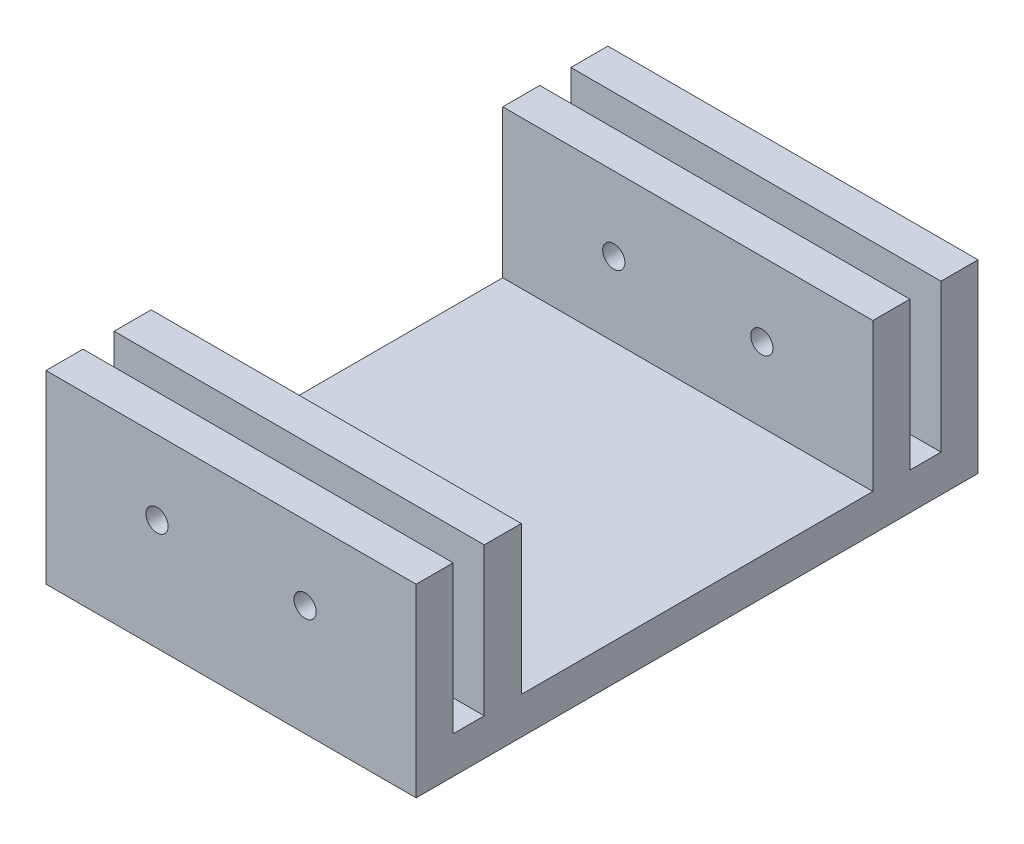
ISO-10303-21;
HEADER;
FILE_DESCRIPTION(('STEP AP214'),'2;1');
FILE_NAME('part.step','',(''),(''),'','','');
FILE_SCHEMA(('AUTOMOTIVE_DESIGN { 1 0 10303 214 1 1 1 1 }'));
ENDSEC;
DATA;
#1=APPLICATION_CONTEXT('core data for automotive mechanical design processes');
#2=APPLICATION_PROTOCOL_DEFINITION('international standard','automotive_design',2000,#1);
#3=PRODUCT_CONTEXT('',#1,'mechanical');
#4=PRODUCT('Part','Part','',(#3));
#5=PRODUCT_RELATED_PRODUCT_CATEGORY('part','',(#4));
#6=PRODUCT_DEFINITION_FORMATION('','',#4);
#7=PRODUCT_DEFINITION_CONTEXT('part definition',#1,'design');
#8=PRODUCT_DEFINITION('design','',#6,#7);
#9=PRODUCT_DEFINITION_SHAPE('','',#8);
#10=(LENGTH_UNIT() NAMED_UNIT(*) SI_UNIT(.MILLI.,.METRE.));
#11=(NAMED_UNIT(*) PLANE_ANGLE_UNIT() SI_UNIT($,.RADIAN.));
#12=(NAMED_UNIT(*) SI_UNIT($,.STERADIAN.) SOLID_ANGLE_UNIT());
#13=UNCERTAINTY_MEASURE_WITH_UNIT(LENGTH_MEASURE(1.E-05),#10,'distance_accuracy_value','');
#14=(GEOMETRIC_REPRESENTATION_CONTEXT(3) GLOBAL_UNCERTAINTY_ASSIGNED_CONTEXT((#13)) GLOBAL_UNIT_ASSIGNED_CONTEXT((#10,
#11,#12)) REPRESENTATION_CONTEXT('',''));
#15=CARTESIAN_POINT('',(0.,0.,0.));
#16=DIRECTION('',(0.,0.,1.));
#17=DIRECTION('',(1.,0.,0.));
#18=AXIS2_PLACEMENT_3D('',#15,#16,#17);
#19=CARTESIAN_POINT('',(50.,22.5,-41.4818181818182));
#20=DIRECTION('',(0.,-1.,0.));
#21=DIRECTION('',(0.,0.,-1.));
#22=AXIS2_PLACEMENT_3D('',#19,#20,#21);
#23=PLANE('',#22);
#24=DIRECTION('',(0.,0.,1.));
#25=VECTOR('',#24,1.);
#26=CARTESIAN_POINT('',(0.,22.5,-41.4818181818182));
#27=LINE('',#26,#25);
#28=CARTESIAN_POINT('',(0.,22.5,-41.4818181818182));
#29=VERTEX_POINT('',#28);
#30=CARTESIAN_POINT('',(0.,22.5,-36.4818181818182));
#31=VERTEX_POINT('',#30);
#32=EDGE_CURVE('E185',#29,#31,#27,.T.);
#33=ORIENTED_EDGE('',*,*,#32,.T.);
#34=DIRECTION('',(-1.,0.,0.));
#35=VECTOR('',#34,1.);
#36=CARTESIAN_POINT('',(50.,22.5,-36.4818181818182));
#37=LINE('',#36,#35);
#38=CARTESIAN_POINT('',(50.,22.5,-36.4818181818182));
#39=VERTEX_POINT('',#38);
#40=EDGE_CURVE('E44',#39,#31,#37,.T.);
#41=ORIENTED_EDGE('',*,*,#40,.F.);
#42=DIRECTION('',(0.,0.,1.));
#43=VECTOR('',#42,1.);
#44=CARTESIAN_POINT('',(50.,22.5,-41.4818181818182));
#45=LINE('',#44,#43);
#46=CARTESIAN_POINT('',(50.,22.5,-41.4818181818182));
#47=VERTEX_POINT('',#46);
#48=EDGE_CURVE('E120',#47,#39,#45,.T.);
#49=ORIENTED_EDGE('',*,*,#48,.F.);
#50=DIRECTION('',(-1.,0.,0.));
#51=VECTOR('',#50,1.);
#52=CARTESIAN_POINT('',(50.,22.5,-41.4818181818182));
#53=LINE('',#52,#51);
#54=EDGE_CURVE('E11',#47,#29,#53,.T.);
#55=ORIENTED_EDGE('',*,*,#54,.T.);
#56=EDGE_LOOP('',(#33,#41,#49,#55));
#57=FACE_BOUND('',#56,.T.);
#58=ADVANCED_FACE('F35',(#57),#23,.F.);
#59=CARTESIAN_POINT('',(50.,22.5,-36.4818181818182));
#60=DIRECTION('',(0.,0.,-1.));
#61=DIRECTION('',(-1.,0.,0.));
#62=AXIS2_PLACEMENT_3D('',#59,#60,#61);
#63=PLANE('',#62);
#64=CARTESIAN_POINT('',(35.,12.5,-36.4818181818182));
#65=DIRECTION('',(0.,0.,-1.));
#66=DIRECTION('',(-1.,0.,0.));
#67=AXIS2_PLACEMENT_3D('',#64,#65,#66);
#68=CIRCLE('',#67,1.5);
#69=CARTESIAN_POINT('',(33.4999999999999,12.5,-36.4818181818182));
#70=VERTEX_POINT('',#69);
#71=EDGE_CURVE('E259',#70,#70,#68,.T.);
#72=ORIENTED_EDGE('',*,*,#71,.T.);
#73=EDGE_LOOP('',(#72));
#74=FACE_BOUND('',#73,.T.);
#75=CARTESIAN_POINT('',(14.9999999999999,12.5,-36.4818181818182));
#76=DIRECTION('',(0.,0.,-1.));
#77=DIRECTION('',(-1.,0.,0.));
#78=AXIS2_PLACEMENT_3D('',#75,#76,#77);
#79=CIRCLE('',#78,1.5);
#80=CARTESIAN_POINT('',(13.4999999999999,12.5,-36.4818181818182));
#81=VERTEX_POINT('',#80);
#82=EDGE_CURVE('E188',#81,#81,#79,.T.);
#83=ORIENTED_EDGE('',*,*,#82,.T.);
#84=EDGE_LOOP('',(#83));
#85=FACE_BOUND('',#84,.T.);
#86=DIRECTION('',(0.,-1.,0.));
#87=VECTOR('',#86,1.);
#88=CARTESIAN_POINT('',(0.,22.5,-36.4818181818182));
#89=LINE('',#88,#87);
#90=CARTESIAN_POINT('',(0.,2.5,-36.4818181818182));
#91=VERTEX_POINT('',#90);
#92=EDGE_CURVE('E187',#31,#91,#89,.T.);
#93=ORIENTED_EDGE('',*,*,#92,.T.);
#94=DIRECTION('',(-1.,0.,0.));
#95=VECTOR('',#94,1.);
#96=CARTESIAN_POINT('',(50.,2.5,-36.4818181818182));
#97=LINE('',#96,#95);
#98=CARTESIAN_POINT('',(50.,2.5,-36.4818181818182));
#99=VERTEX_POINT('',#98);
#100=EDGE_CURVE('E245',#99,#91,#97,.T.);
#101=ORIENTED_EDGE('',*,*,#100,.F.);
#102=DIRECTION('',(0.,-1.,0.));
#103=VECTOR('',#102,1.);
#104=CARTESIAN_POINT('',(50.,22.5,-36.4818181818182));
#105=LINE('',#104,#103);
#106=EDGE_CURVE('E283',#39,#99,#105,.T.);
#107=ORIENTED_EDGE('',*,*,#106,.F.);
#108=ORIENTED_EDGE('',*,*,#40,.T.);
#109=EDGE_LOOP('',(#93,#101,#107,#108));
#110=FACE_BOUND('',#109,.T.);
#111=ADVANCED_FACE('F322',(#74,#85,#110),#63,.F.);
#112=CARTESIAN_POINT('',(50.,2.5,-32.2818181818182));
#113=DIRECTION('',(0.,-1.,0.));
#114=DIRECTION('',(0.,0.,-1.));
#115=AXIS2_PLACEMENT_3D('',#112,#113,#114);
#116=PLANE('',#115);
#117=DIRECTION('',(0.,0.,1.));
#118=VECTOR('',#117,1.);
#119=CARTESIAN_POINT('',(0.,2.5,-32.2818181818182));
#120=LINE('',#119,#118);
#121=CARTESIAN_POINT('',(0.,2.5,-32.2818181818182));
#122=VERTEX_POINT('',#121);
#123=EDGE_CURVE('E190',#91,#122,#120,.T.);
#124=ORIENTED_EDGE('',*,*,#123,.T.);
#125=DIRECTION('',(-1.,0.,0.));
#126=VECTOR('',#125,1.);
#127=CARTESIAN_POINT('',(50.,2.5,-32.2818181818182));
#128=LINE('',#127,#126);
#129=CARTESIAN_POINT('',(50.,2.5,-32.2818181818182));
#130=VERTEX_POINT('',#129);
#131=EDGE_CURVE('E242',#130,#122,#128,.T.);
#132=ORIENTED_EDGE('',*,*,#131,.F.);
#133=DIRECTION('',(0.,0.,1.));
#134=VECTOR('',#133,1.);
#135=CARTESIAN_POINT('',(50.,2.5,-32.2818181818182));
#136=LINE('',#135,#134);
#137=EDGE_CURVE('E285',#99,#130,#136,.T.);
#138=ORIENTED_EDGE('',*,*,#137,.F.);
#139=ORIENTED_EDGE('',*,*,#100,.T.);
#140=EDGE_LOOP('',(#124,#132,#138,#139));
#141=FACE_BOUND('',#140,.T.);
#142=ADVANCED_FACE('F327',(#141),#116,.F.);
#143=CARTESIAN_POINT('',(50.,2.5,-32.2818181818182));
#144=DIRECTION('',(0.,0.,1.));
#145=DIRECTION('',(1.,0.,0.));
#146=AXIS2_PLACEMENT_3D('',#143,#144,#145);
#147=PLANE('',#146);
#148=CARTESIAN_POINT('',(35.,12.5,-32.2818181818182));
#149=DIRECTION('',(0.,0.,1.));
#150=DIRECTION('',(1.,0.,0.));
#151=AXIS2_PLACEMENT_3D('',#148,#149,#150);
#152=CIRCLE('',#151,1.5);
#153=CARTESIAN_POINT('',(36.5,12.5,-32.2818181818182));
#154=VERTEX_POINT('',#153);
#155=EDGE_CURVE('E264',#154,#154,#152,.T.);
#156=ORIENTED_EDGE('',*,*,#155,.T.);
#157=EDGE_LOOP('',(#156));
#158=FACE_BOUND('',#157,.T.);
#159=CARTESIAN_POINT('',(14.9999999999999,12.5,-32.2818181818182));
#160=DIRECTION('',(0.,0.,1.));
#161=DIRECTION('',(1.,0.,0.));
#162=AXIS2_PLACEMENT_3D('',#159,#160,#161);
#163=CIRCLE('',#162,1.5);
#164=CARTESIAN_POINT('',(16.4999999999999,12.5,-32.2818181818182));
#165=VERTEX_POINT('',#164);
#166=EDGE_CURVE('E276',#165,#165,#163,.T.);
#167=ORIENTED_EDGE('',*,*,#166,.T.);
#168=EDGE_LOOP('',(#167));
#169=FACE_BOUND('',#168,.T.);
#170=DIRECTION('',(0.,1.,0.));
#171=VECTOR('',#170,1.);
#172=CARTESIAN_POINT('',(0.,2.5,-32.2818181818182));
#173=LINE('',#172,#171);
#174=CARTESIAN_POINT('',(0.,22.5,-32.2818181818182));
#175=VERTEX_POINT('',#174);
#176=EDGE_CURVE('E192',#122,#175,#173,.T.);
#177=ORIENTED_EDGE('',*,*,#176,.T.);
#178=DIRECTION('',(-1.,0.,0.));
#179=VECTOR('',#178,1.);
#180=CARTESIAN_POINT('',(50.,22.5,-32.2818181818182));
#181=LINE('',#180,#179);
#182=CARTESIAN_POINT('',(50.,22.5,-32.2818181818182));
#183=VERTEX_POINT('',#182);
#184=EDGE_CURVE('E239',#183,#175,#181,.T.);
#185=ORIENTED_EDGE('',*,*,#184,.F.);
#186=DIRECTION('',(0.,1.,0.));
#187=VECTOR('',#186,1.);
#188=CARTESIAN_POINT('',(50.,2.5,-32.2818181818182));
#189=LINE('',#188,#187);
#190=EDGE_CURVE('E287',#130,#183,#189,.T.);
#191=ORIENTED_EDGE('',*,*,#190,.F.);
#192=ORIENTED_EDGE('',*,*,#131,.T.);
#193=EDGE_LOOP('',(#177,#185,#191,#192));
#194=FACE_BOUND('',#193,.T.);
#195=ADVANCED_FACE('F333',(#158,#169,#194),#147,.F.);
#196=CARTESIAN_POINT('',(50.,22.5,-32.2818181818182));
#197=DIRECTION('',(0.,-1.,0.));
#198=DIRECTION('',(0.,0.,-1.));
#199=AXIS2_PLACEMENT_3D('',#196,#197,#198);
#200=PLANE('',#199);
#201=DIRECTION('',(0.,0.,1.));
#202=VECTOR('',#201,1.);
#203=CARTESIAN_POINT('',(0.,22.5,-32.2818181818182));
#204=LINE('',#203,#202);
#205=CARTESIAN_POINT('',(0.,22.5,-27.2818181818182));
#206=VERTEX_POINT('',#205);
#207=EDGE_CURVE('E194',#175,#206,#204,.T.);
#208=ORIENTED_EDGE('',*,*,#207,.T.);
#209=DIRECTION('',(-1.,0.,0.));
#210=VECTOR('',#209,1.);
#211=CARTESIAN_POINT('',(50.,22.5,-27.2818181818182));
#212=LINE('',#211,#210);
#213=CARTESIAN_POINT('',(50.,22.5,-27.2818181818182));
#214=VERTEX_POINT('',#213);
#215=EDGE_CURVE('E236',#214,#206,#212,.T.);
#216=ORIENTED_EDGE('',*,*,#215,.F.);
#217=DIRECTION('',(0.,0.,1.));
#218=VECTOR('',#217,1.);
#219=CARTESIAN_POINT('',(50.,22.5,-32.2818181818182));
#220=LINE('',#219,#218);
#221=EDGE_CURVE('E289',#183,#214,#220,.T.);
#222=ORIENTED_EDGE('',*,*,#221,.F.);
#223=ORIENTED_EDGE('',*,*,#184,.T.);
#224=EDGE_LOOP('',(#208,#216,#222,#223));
#225=FACE_BOUND('',#224,.T.);
#226=ADVANCED_FACE('F337',(#225),#200,.F.);
#227=CARTESIAN_POINT('',(50.,22.5,-27.2818181818182));
#228=DIRECTION('',(0.,0.,-1.));
#229=DIRECTION('',(0.,1.,0.));
#230=AXIS2_PLACEMENT_3D('',#227,#228,#229);
#231=PLANE('',#230);
#232=CARTESIAN_POINT('',(35.,12.5,-27.2818181818182));
#233=DIRECTION('',(0.,0.,-1.));
#234=DIRECTION('',(0.,1.,0.));
#235=AXIS2_PLACEMENT_3D('',#232,#233,#234);
#236=CIRCLE('',#235,1.5);
#237=CARTESIAN_POINT('',(35.,14.,-27.2818181818182));
#238=VERTEX_POINT('',#237);
#239=EDGE_CURVE('E455',#238,#238,#236,.T.);
#240=ORIENTED_EDGE('',*,*,#239,.T.);
#241=EDGE_LOOP('',(#240));
#242=FACE_BOUND('',#241,.T.);
#243=CARTESIAN_POINT('',(14.9999999999999,12.5,-27.2818181818182));
#244=DIRECTION('',(0.,0.,-1.));
#245=DIRECTION('',(0.,1.,0.));
#246=AXIS2_PLACEMENT_3D('',#243,#244,#245);
#247=CIRCLE('',#246,1.5);
#248=CARTESIAN_POINT('',(14.9999999999999,14.,-27.2818181818182));
#249=VERTEX_POINT('',#248);
#250=EDGE_CURVE('E273',#249,#249,#247,.T.);
#251=ORIENTED_EDGE('',*,*,#250,.T.);
#252=EDGE_LOOP('',(#251));
#253=FACE_BOUND('',#252,.T.);
#254=DIRECTION('',(0.,-1.,0.));
#255=VECTOR('',#254,1.);
#256=CARTESIAN_POINT('',(0.,22.5,-27.2818181818182));
#257=LINE('',#256,#255);
#258=CARTESIAN_POINT('',(0.,2.5,-27.2818181818182));
#259=VERTEX_POINT('',#258);
#260=EDGE_CURVE('E196',#206,#259,#257,.T.);
#261=ORIENTED_EDGE('',*,*,#260,.T.);
#262=DIRECTION('',(-1.,0.,0.));
#263=VECTOR('',#262,1.);
#264=CARTESIAN_POINT('',(50.,2.5,-27.2818181818182));
#265=LINE('',#264,#263);
#266=CARTESIAN_POINT('',(50.,2.5,-27.2818181818182));
#267=VERTEX_POINT('',#266);
#268=EDGE_CURVE('E233',#267,#259,#265,.T.);
#269=ORIENTED_EDGE('',*,*,#268,.F.);
#270=DIRECTION('',(0.,-1.,0.));
#271=VECTOR('',#270,1.);
#272=CARTESIAN_POINT('',(50.,22.5,-27.2818181818182));
#273=LINE('',#272,#271);
#274=EDGE_CURVE('E291',#214,#267,#273,.T.);
#275=ORIENTED_EDGE('',*,*,#274,.F.);
#276=ORIENTED_EDGE('',*,*,#215,.T.);
#277=EDGE_LOOP('',(#261,#269,#275,#276));
#278=FACE_BOUND('',#277,.T.);
#279=ADVANCED_FACE('F342',(#242,#253,#278),#231,.F.);
#280=CARTESIAN_POINT('',(50.,2.5,20.2181818181818));
#281=DIRECTION('',(0.,-1.,0.));
#282=DIRECTION('',(0.,0.,-1.));
#283=AXIS2_PLACEMENT_3D('',#280,#281,#282);
#284=PLANE('',#283);
#285=DIRECTION('',(0.,0.,1.));
#286=VECTOR('',#285,1.);
#287=CARTESIAN_POINT('',(0.,2.5,20.2181818181818));
#288=LINE('',#287,#286);
#289=CARTESIAN_POINT('',(0.,2.5,20.2181818181818));
#290=VERTEX_POINT('',#289);
#291=EDGE_CURVE('E198',#259,#290,#288,.T.);
#292=ORIENTED_EDGE('',*,*,#291,.T.);
#293=DIRECTION('',(-1.,0.,0.));
#294=VECTOR('',#293,1.);
#295=CARTESIAN_POINT('',(50.,2.5,20.2181818181818));
#296=LINE('',#295,#294);
#297=CARTESIAN_POINT('',(50.,2.5,20.2181818181818));
#298=VERTEX_POINT('',#297);
#299=EDGE_CURVE('E230',#298,#290,#296,.T.);
#300=ORIENTED_EDGE('',*,*,#299,.F.);
#301=DIRECTION('',(0.,0.,1.));
#302=VECTOR('',#301,1.);
#303=CARTESIAN_POINT('',(50.,2.5,20.2181818181818));
#304=LINE('',#303,#302);
#305=EDGE_CURVE('E293',#267,#298,#304,.T.);
#306=ORIENTED_EDGE('',*,*,#305,.F.);
#307=ORIENTED_EDGE('',*,*,#268,.T.);
#308=EDGE_LOOP('',(#292,#300,#306,#307));
#309=FACE_BOUND('',#308,.T.);
#310=ADVANCED_FACE('F348',(#309),#284,.F.);
#311=CARTESIAN_POINT('',(50.,22.5,20.2181818181818));
#312=DIRECTION('',(0.,0.,1.));
#313=DIRECTION('',(1.,0.,0.));
#314=AXIS2_PLACEMENT_3D('',#311,#312,#313);
#315=PLANE('',#314);
#316=CARTESIAN_POINT('',(35.,12.5,20.2181818181818));
#317=DIRECTION('',(0.,0.,1.));
#318=DIRECTION('',(1.,0.,0.));
#319=AXIS2_PLACEMENT_3D('',#316,#317,#318);
#320=CIRCLE('',#319,1.5);
#321=CARTESIAN_POINT('',(36.5,12.5,20.2181818181818));
#322=VERTEX_POINT('',#321);
#323=EDGE_CURVE('E402',#322,#322,#320,.T.);
#324=ORIENTED_EDGE('',*,*,#323,.T.);
#325=EDGE_LOOP('',(#324));
#326=FACE_BOUND('',#325,.T.);
#327=CARTESIAN_POINT('',(14.9999999999999,12.5,20.2181818181818));
#328=DIRECTION('',(0.,0.,1.));
#329=DIRECTION('',(1.,0.,0.));
#330=AXIS2_PLACEMENT_3D('',#327,#328,#329);
#331=CIRCLE('',#330,1.5);
#332=CARTESIAN_POINT('',(16.4999999999999,12.5,20.2181818181818));
#333=VERTEX_POINT('',#332);
#334=EDGE_CURVE('E270',#333,#333,#331,.T.);
#335=ORIENTED_EDGE('',*,*,#334,.T.);
#336=EDGE_LOOP('',(#335));
#337=FACE_BOUND('',#336,.T.);
#338=DIRECTION('',(0.,1.,0.));
#339=VECTOR('',#338,1.);
#340=CARTESIAN_POINT('',(0.,22.5,20.2181818181818));
#341=LINE('',#340,#339);
#342=CARTESIAN_POINT('',(0.,22.5,20.2181818181818));
#343=VERTEX_POINT('',#342);
#344=EDGE_CURVE('E200',#290,#343,#341,.T.);
#345=ORIENTED_EDGE('',*,*,#344,.T.);
#346=DIRECTION('',(-1.,0.,0.));
#347=VECTOR('',#346,1.);
#348=CARTESIAN_POINT('',(50.,22.5,20.2181818181818));
#349=LINE('',#348,#347);
#350=CARTESIAN_POINT('',(50.,22.5,20.2181818181818));
#351=VERTEX_POINT('',#350);
#352=EDGE_CURVE('E227',#351,#343,#349,.T.);
#353=ORIENTED_EDGE('',*,*,#352,.F.);
#354=DIRECTION('',(0.,1.,0.));
#355=VECTOR('',#354,1.);
#356=CARTESIAN_POINT('',(50.,22.5,20.2181818181818));
#357=LINE('',#356,#355);
#358=EDGE_CURVE('E295',#298,#351,#357,.T.);
#359=ORIENTED_EDGE('',*,*,#358,.F.);
#360=ORIENTED_EDGE('',*,*,#299,.T.);
#361=EDGE_LOOP('',(#345,#353,#359,#360));
#362=FACE_BOUND('',#361,.T.);
#363=ADVANCED_FACE('F352',(#326,#337,#362),#315,.F.);
#364=CARTESIAN_POINT('',(50.,22.5,25.2181818181818));
#365=DIRECTION('',(0.,-1.,0.));
#366=DIRECTION('',(0.,0.,-1.));
#367=AXIS2_PLACEMENT_3D('',#364,#365,#366);
#368=PLANE('',#367);
#369=DIRECTION('',(0.,0.,1.));
#370=VECTOR('',#369,1.);
#371=CARTESIAN_POINT('',(0.,22.5,25.2181818181818));
#372=LINE('',#371,#370);
#373=CARTESIAN_POINT('',(0.,22.5,25.2181818181818));
#374=VERTEX_POINT('',#373);
#375=EDGE_CURVE('E202',#343,#374,#372,.T.);
#376=ORIENTED_EDGE('',*,*,#375,.T.);
#377=DIRECTION('',(-1.,0.,0.));
#378=VECTOR('',#377,1.);
#379=CARTESIAN_POINT('',(50.,22.5,25.2181818181818));
#380=LINE('',#379,#378);
#381=CARTESIAN_POINT('',(50.,22.5,25.2181818181818));
#382=VERTEX_POINT('',#381);
#383=EDGE_CURVE('E224',#382,#374,#380,.T.);
#384=ORIENTED_EDGE('',*,*,#383,.F.);
#385=DIRECTION('',(0.,0.,1.));
#386=VECTOR('',#385,1.);
#387=CARTESIAN_POINT('',(50.,22.5,25.2181818181818));
#388=LINE('',#387,#386);
#389=EDGE_CURVE('E297',#351,#382,#388,.T.);
#390=ORIENTED_EDGE('',*,*,#389,.F.);
#391=ORIENTED_EDGE('',*,*,#352,.T.);
#392=EDGE_LOOP('',(#376,#384,#390,#391));
#393=FACE_BOUND('',#392,.T.);
#394=ADVANCED_FACE('F357',(#393),#368,.F.);
#395=CARTESIAN_POINT('',(50.,2.5,25.2181818181818));
#396=DIRECTION('',(0.,0.,-1.));
#397=DIRECTION('',(-1.,0.,0.));
#398=AXIS2_PLACEMENT_3D('',#395,#396,#397);
#399=PLANE('',#398);
#400=CARTESIAN_POINT('',(35.,12.5,25.2181818181818));
#401=DIRECTION('',(0.,0.,-1.));
#402=DIRECTION('',(-1.,0.,0.));
#403=AXIS2_PLACEMENT_3D('',#400,#401,#402);
#404=CIRCLE('',#403,1.5);
#405=CARTESIAN_POINT('',(33.4999999999999,12.5,25.2181818181818));
#406=VERTEX_POINT('',#405);
#407=EDGE_CURVE('E447',#406,#406,#404,.T.);
#408=ORIENTED_EDGE('',*,*,#407,.T.);
#409=EDGE_LOOP('',(#408));
#410=FACE_BOUND('',#409,.T.);
#411=CARTESIAN_POINT('',(14.9999999999999,12.5,25.2181818181818));
#412=DIRECTION('',(0.,0.,-1.));
#413=DIRECTION('',(-1.,0.,0.));
#414=AXIS2_PLACEMENT_3D('',#411,#412,#413);
#415=CIRCLE('',#414,1.5);
#416=CARTESIAN_POINT('',(13.4999999999999,12.5,25.2181818181818));
#417=VERTEX_POINT('',#416);
#418=EDGE_CURVE('E256',#417,#417,#415,.T.);
#419=ORIENTED_EDGE('',*,*,#418,.T.);
#420=EDGE_LOOP('',(#419));
#421=FACE_BOUND('',#420,.T.);
#422=DIRECTION('',(0.,-1.,0.));
#423=VECTOR('',#422,1.);
#424=CARTESIAN_POINT('',(0.,2.5,25.2181818181818));
#425=LINE('',#424,#423);
#426=CARTESIAN_POINT('',(0.,2.5,25.2181818181818));
#427=VERTEX_POINT('',#426);
#428=EDGE_CURVE('E204',#374,#427,#425,.T.);
#429=ORIENTED_EDGE('',*,*,#428,.T.);
#430=DIRECTION('',(-1.,0.,0.));
#431=VECTOR('',#430,1.);
#432=CARTESIAN_POINT('',(50.,2.5,25.2181818181818));
#433=LINE('',#432,#431);
#434=CARTESIAN_POINT('',(50.,2.5,25.2181818181818));
#435=VERTEX_POINT('',#434);
#436=EDGE_CURVE('E221',#435,#427,#433,.T.);
#437=ORIENTED_EDGE('',*,*,#436,.F.);
#438=DIRECTION('',(0.,-1.,0.));
#439=VECTOR('',#438,1.);
#440=CARTESIAN_POINT('',(50.,2.5,25.2181818181818));
#441=LINE('',#440,#439);
#442=EDGE_CURVE('E299',#382,#435,#441,.T.);
#443=ORIENTED_EDGE('',*,*,#442,.F.);
#444=ORIENTED_EDGE('',*,*,#383,.T.);
#445=EDGE_LOOP('',(#429,#437,#443,#444));
#446=FACE_BOUND('',#445,.T.);
#447=ADVANCED_FACE('F360',(#410,#421,#446),#399,.F.);
#448=CARTESIAN_POINT('',(50.,2.5,29.4181818181818));
#449=DIRECTION('',(0.,-1.,0.));
#450=DIRECTION('',(0.,0.,-1.));
#451=AXIS2_PLACEMENT_3D('',#448,#449,#450);
#452=PLANE('',#451);
#453=DIRECTION('',(0.,0.,1.));
#454=VECTOR('',#453,1.);
#455=CARTESIAN_POINT('',(0.,2.5,29.4181818181818));
#456=LINE('',#455,#454);
#457=CARTESIAN_POINT('',(0.,2.5,29.4181818181818));
#458=VERTEX_POINT('',#457);
#459=EDGE_CURVE('E206',#427,#458,#456,.T.);
#460=ORIENTED_EDGE('',*,*,#459,.T.);
#461=DIRECTION('',(-1.,0.,0.));
#462=VECTOR('',#461,1.);
#463=CARTESIAN_POINT('',(50.,2.5,29.4181818181818));
#464=LINE('',#463,#462);
#465=CARTESIAN_POINT('',(50.,2.5,29.4181818181818));
#466=VERTEX_POINT('',#465);
#467=EDGE_CURVE('E218',#466,#458,#464,.T.);
#468=ORIENTED_EDGE('',*,*,#467,.F.);
#469=DIRECTION('',(0.,0.,1.));
#470=VECTOR('',#469,1.);
#471=CARTESIAN_POINT('',(50.,2.5,29.4181818181818));
#472=LINE('',#471,#470);
#473=EDGE_CURVE('E301',#435,#466,#472,.T.);
#474=ORIENTED_EDGE('',*,*,#473,.F.);
#475=ORIENTED_EDGE('',*,*,#436,.T.);
#476=EDGE_LOOP('',(#460,#468,#474,#475));
#477=FACE_BOUND('',#476,.T.);
#478=ADVANCED_FACE('F307',(#477),#452,.F.);
#479=CARTESIAN_POINT('',(50.,22.5,29.4181818181818));
#480=DIRECTION('',(0.,0.,1.));
#481=DIRECTION('',(1.,0.,0.));
#482=AXIS2_PLACEMENT_3D('',#479,#480,#481);
#483=PLANE('',#482);
#484=CARTESIAN_POINT('',(35.,12.5,29.4181818181818));
#485=DIRECTION('',(0.,0.,1.));
#486=DIRECTION('',(1.,0.,0.));
#487=AXIS2_PLACEMENT_3D('',#484,#485,#486);
#488=CIRCLE('',#487,1.5);
#489=CARTESIAN_POINT('',(36.5,12.5,29.4181818181818));
#490=VERTEX_POINT('',#489);
#491=EDGE_CURVE('E443',#490,#490,#488,.T.);
#492=ORIENTED_EDGE('',*,*,#491,.T.);
#493=EDGE_LOOP('',(#492));
#494=FACE_BOUND('',#493,.T.);
#495=CARTESIAN_POINT('',(14.9999999999999,12.5,29.4181818181818));
#496=DIRECTION('',(0.,0.,1.));
#497=DIRECTION('',(1.,0.,0.));
#498=AXIS2_PLACEMENT_3D('',#495,#496,#497);
#499=CIRCLE('',#498,1.5);
#500=CARTESIAN_POINT('',(16.4999999999999,12.5,29.4181818181818));
#501=VERTEX_POINT('',#500);
#502=EDGE_CURVE('E251',#501,#501,#499,.T.);
#503=ORIENTED_EDGE('',*,*,#502,.T.);
#504=EDGE_LOOP('',(#503));
#505=FACE_BOUND('',#504,.T.);
#506=DIRECTION('',(0.,1.,0.));
#507=VECTOR('',#506,1.);
#508=CARTESIAN_POINT('',(0.,22.5,29.4181818181818));
#509=LINE('',#508,#507);
#510=CARTESIAN_POINT('',(0.,22.5,29.4181818181818));
#511=VERTEX_POINT('',#510);
#512=EDGE_CURVE('E208',#458,#511,#509,.T.);
#513=ORIENTED_EDGE('',*,*,#512,.T.);
#514=DIRECTION('',(-1.,0.,0.));
#515=VECTOR('',#514,1.);
#516=CARTESIAN_POINT('',(50.,22.5,29.4181818181818));
#517=LINE('',#516,#515);
#518=CARTESIAN_POINT('',(50.,22.5,29.4181818181818));
#519=VERTEX_POINT('',#518);
#520=EDGE_CURVE('E174',#519,#511,#517,.T.);
#521=ORIENTED_EDGE('',*,*,#520,.F.);
#522=DIRECTION('',(0.,1.,0.));
#523=VECTOR('',#522,1.);
#524=CARTESIAN_POINT('',(50.,22.5,29.4181818181818));
#525=LINE('',#524,#523);
#526=EDGE_CURVE('E164',#466,#519,#525,.T.);
#527=ORIENTED_EDGE('',*,*,#526,.F.);
#528=ORIENTED_EDGE('',*,*,#467,.T.);
#529=EDGE_LOOP('',(#513,#521,#527,#528));
#530=FACE_BOUND('',#529,.T.);
#531=ADVANCED_FACE('F311',(#494,#505,#530),#483,.F.);
#532=CARTESIAN_POINT('',(50.,22.5,34.4181818181818));
#533=DIRECTION('',(0.,-1.,0.));
#534=DIRECTION('',(0.,0.,-1.));
#535=AXIS2_PLACEMENT_3D('',#532,#533,#534);
#536=PLANE('',#535);
#537=DIRECTION('',(0.,0.,1.));
#538=VECTOR('',#537,1.);
#539=CARTESIAN_POINT('',(0.,22.5,34.4181818181818));
#540=LINE('',#539,#538);
#541=CARTESIAN_POINT('',(0.,22.5,34.4181818181818));
#542=VERTEX_POINT('',#541);
#543=EDGE_CURVE('E173',#511,#542,#540,.T.);
#544=ORIENTED_EDGE('',*,*,#543,.T.);
#545=DIRECTION('',(-1.,0.,0.));
#546=VECTOR('',#545,1.);
#547=CARTESIAN_POINT('',(50.,22.5,34.4181818181818));
#548=LINE('',#547,#546);
#549=CARTESIAN_POINT('',(50.,22.5,34.4181818181818));
#550=VERTEX_POINT('',#549);
#551=EDGE_CURVE('E170',#550,#542,#548,.T.);
#552=ORIENTED_EDGE('',*,*,#551,.F.);
#553=DIRECTION('',(0.,0.,1.));
#554=VECTOR('',#553,1.);
#555=CARTESIAN_POINT('',(50.,22.5,34.4181818181818));
#556=LINE('',#555,#554);
#557=EDGE_CURVE('E158',#519,#550,#556,.T.);
#558=ORIENTED_EDGE('',*,*,#557,.F.);
#559=ORIENTED_EDGE('',*,*,#520,.T.);
#560=EDGE_LOOP('',(#544,#552,#558,#559));
#561=FACE_BOUND('',#560,.T.);
#562=ADVANCED_FACE('F171',(#561),#536,.F.);
#563=CARTESIAN_POINT('',(50.,-2.5,34.4181818181818));
#564=DIRECTION('',(0.,0.,-1.));
#565=DIRECTION('',(0.,1.,0.));
#566=AXIS2_PLACEMENT_3D('',#563,#564,#565);
#567=PLANE('',#566);
#568=CARTESIAN_POINT('',(35.,12.5,34.4181818181818));
#569=DIRECTION('',(0.,0.,1.));
#570=DIRECTION('',(1.,0.,0.));
#571=AXIS2_PLACEMENT_3D('',#568,#569,#570);
#572=CIRCLE('',#571,1.5);
#573=CARTESIAN_POINT('',(36.5,12.5,34.4181818181818));
#574=VERTEX_POINT('',#573);
#575=EDGE_CURVE('E451',#574,#574,#572,.T.);
#576=ORIENTED_EDGE('',*,*,#575,.F.);
#577=EDGE_LOOP('',(#576));
#578=FACE_BOUND('',#577,.T.);
#579=CARTESIAN_POINT('',(14.9999999999999,12.5,34.4181818181818));
#580=DIRECTION('',(0.,0.,1.));
#581=DIRECTION('',(1.,0.,0.));
#582=AXIS2_PLACEMENT_3D('',#579,#580,#581);
#583=CIRCLE('',#582,1.5);
#584=CARTESIAN_POINT('',(16.4999999999999,12.5,34.4181818181818));
#585=VERTEX_POINT('',#584);
#586=EDGE_CURVE('E252',#585,#585,#583,.T.);
#587=ORIENTED_EDGE('',*,*,#586,.F.);
#588=EDGE_LOOP('',(#587));
#589=FACE_BOUND('',#588,.T.);
#590=DIRECTION('',(0.,-1.,0.));
#591=VECTOR('',#590,1.);
#592=CARTESIAN_POINT('',(0.,-2.5,34.4181818181818));
#593=LINE('',#592,#591);
#594=CARTESIAN_POINT('',(0.,-2.5,34.4181818181818));
#595=VERTEX_POINT('',#594);
#596=EDGE_CURVE('E106',#542,#595,#593,.T.);
#597=ORIENTED_EDGE('',*,*,#596,.T.);
#598=DIRECTION('',(-1.,0.,0.));
#599=VECTOR('',#598,1.);
#600=CARTESIAN_POINT('',(50.,-2.5,34.4181818181818));
#601=LINE('',#600,#599);
#602=CARTESIAN_POINT('',(50.,-2.5,34.4181818181818));
#603=VERTEX_POINT('',#602);
#604=EDGE_CURVE('E175',#603,#595,#601,.T.);
#605=ORIENTED_EDGE('',*,*,#604,.F.);
#606=DIRECTION('',(0.,-1.,0.));
#607=VECTOR('',#606,1.);
#608=CARTESIAN_POINT('',(50.,2.5,34.4181818181818));
#609=LINE('',#608,#607);
#610=EDGE_CURVE('E162',#550,#603,#609,.T.);
#611=ORIENTED_EDGE('',*,*,#610,.F.);
#612=ORIENTED_EDGE('',*,*,#551,.T.);
#613=EDGE_LOOP('',(#597,#605,#611,#612));
#614=FACE_BOUND('',#613,.T.);
#615=ADVANCED_FACE('F177',(#578,#589,#614),#567,.F.);
#616=CARTESIAN_POINT('',(50.,-2.5,34.4181818181818));
#617=DIRECTION('',(0.,1.,0.));
#618=DIRECTION('',(0.,0.,1.));
#619=AXIS2_PLACEMENT_3D('',#616,#617,#618);
#620=PLANE('',#619);
#621=DIRECTION('',(0.,0.,-1.));
#622=VECTOR('',#621,1.);
#623=CARTESIAN_POINT('',(0.,-2.5,34.4181818181818));
#624=LINE('',#623,#622);
#625=CARTESIAN_POINT('',(0.,-2.5,-41.4818181818182));
#626=VERTEX_POINT('',#625);
#627=EDGE_CURVE('E113',#595,#626,#624,.T.);
#628=ORIENTED_EDGE('',*,*,#627,.T.);
#629=DIRECTION('',(-1.,0.,0.));
#630=VECTOR('',#629,1.);
#631=CARTESIAN_POINT('',(50.,-2.5,-41.4818181818182));
#632=LINE('',#631,#630);
#633=CARTESIAN_POINT('',(50.,-2.5,-41.4818181818182));
#634=VERTEX_POINT('',#633);
#635=EDGE_CURVE('E181',#634,#626,#632,.T.);
#636=ORIENTED_EDGE('',*,*,#635,.F.);
#637=DIRECTION('',(0.,0.,-1.));
#638=VECTOR('',#637,1.);
#639=CARTESIAN_POINT('',(50.,-2.5,34.4181818181818));
#640=LINE('',#639,#638);
#641=EDGE_CURVE('E179',#603,#634,#640,.T.);
#642=ORIENTED_EDGE('',*,*,#641,.F.);
#643=ORIENTED_EDGE('',*,*,#604,.T.);
#644=EDGE_LOOP('',(#628,#636,#642,#643));
#645=FACE_BOUND('',#644,.T.);
#646=ADVANCED_FACE('F318',(#645),#620,.F.);
#647=CARTESIAN_POINT('',(50.,-2.5,-41.4818181818182));
#648=DIRECTION('',(0.,0.,1.));
#649=DIRECTION('',(0.,-1.,0.));
#650=AXIS2_PLACEMENT_3D('',#647,#648,#649);
#651=PLANE('',#650);
#652=CARTESIAN_POINT('',(35.,12.5,-41.4818181818182));
#653=DIRECTION('',(0.,0.,1.));
#654=DIRECTION('',(0.,-1.,0.));
#655=AXIS2_PLACEMENT_3D('',#652,#653,#654);
#656=CIRCLE('',#655,1.5);
#657=CARTESIAN_POINT('',(35.,11.,-41.4818181818182));
#658=VERTEX_POINT('',#657);
#659=EDGE_CURVE('E38',#658,#658,#656,.T.);
#660=ORIENTED_EDGE('',*,*,#659,.T.);
#661=EDGE_LOOP('',(#660));
#662=FACE_BOUND('',#661,.T.);
#663=CARTESIAN_POINT('',(14.9999999999999,12.5,-41.4818181818182));
#664=DIRECTION('',(0.,0.,1.));
#665=DIRECTION('',(0.,-1.,0.));
#666=AXIS2_PLACEMENT_3D('',#663,#664,#665);
#667=CIRCLE('',#666,1.5);
#668=CARTESIAN_POINT('',(14.9999999999999,11.,-41.4818181818182));
#669=VERTEX_POINT('',#668);
#670=EDGE_CURVE('E249',#669,#669,#667,.T.);
#671=ORIENTED_EDGE('',*,*,#670,.T.);
#672=EDGE_LOOP('',(#671));
#673=FACE_BOUND('',#672,.T.);
#674=DIRECTION('',(0.,1.,0.));
#675=VECTOR('',#674,1.);
#676=CARTESIAN_POINT('',(0.,-2.5,-41.4818181818182));
#677=LINE('',#676,#675);
#678=EDGE_CURVE('E213',#626,#29,#677,.T.);
#679=ORIENTED_EDGE('',*,*,#678,.T.);
#680=ORIENTED_EDGE('',*,*,#54,.F.);
#681=DIRECTION('',(0.,1.,0.));
#682=VECTOR('',#681,1.);
#683=CARTESIAN_POINT('',(50.,2.5,-41.4818181818182));
#684=LINE('',#683,#682);
#685=EDGE_CURVE('E53',#634,#47,#684,.T.);
#686=ORIENTED_EDGE('',*,*,#685,.F.);
#687=ORIENTED_EDGE('',*,*,#635,.T.);
#688=EDGE_LOOP('',(#679,#680,#686,#687));
#689=FACE_BOUND('',#688,.T.);
#690=ADVANCED_FACE('F317',(#662,#673,#689),#651,.F.);
#691=CARTESIAN_POINT('',(50.,0.,0.));
#692=DIRECTION('',(1.,0.,0.));
#693=DIRECTION('',(0.,0.,-1.));
#694=AXIS2_PLACEMENT_3D('',#691,#692,#693);
#695=PLANE('',#694);
#696=ORIENTED_EDGE('',*,*,#685,.T.);
#697=ORIENTED_EDGE('',*,*,#48,.T.);
#698=ORIENTED_EDGE('',*,*,#106,.T.);
#699=ORIENTED_EDGE('',*,*,#137,.T.);
#700=ORIENTED_EDGE('',*,*,#190,.T.);
#701=ORIENTED_EDGE('',*,*,#221,.T.);
#702=ORIENTED_EDGE('',*,*,#274,.T.);
#703=ORIENTED_EDGE('',*,*,#305,.T.);
#704=ORIENTED_EDGE('',*,*,#358,.T.);
#705=ORIENTED_EDGE('',*,*,#389,.T.);
#706=ORIENTED_EDGE('',*,*,#442,.T.);
#707=ORIENTED_EDGE('',*,*,#473,.T.);
#708=ORIENTED_EDGE('',*,*,#526,.T.);
#709=ORIENTED_EDGE('',*,*,#557,.T.);
#710=ORIENTED_EDGE('',*,*,#610,.T.);
#711=ORIENTED_EDGE('',*,*,#641,.T.);
#712=EDGE_LOOP('',(#696,#697,#698,#699,#700,#701,#702,#703,#704,#705,#706,#707,#708,#709,#710,#711));
#713=FACE_BOUND('',#712,.T.);
#714=ADVANCED_FACE('F160',(#713),#695,.T.);
#715=CARTESIAN_POINT('',(0.,0.,0.));
#716=DIRECTION('',(1.,0.,0.));
#717=DIRECTION('',(0.,0.,-1.));
#718=AXIS2_PLACEMENT_3D('',#715,#716,#717);
#719=PLANE('',#718);
#720=ORIENTED_EDGE('',*,*,#32,.F.);
#721=ORIENTED_EDGE('',*,*,#678,.F.);
#722=ORIENTED_EDGE('',*,*,#627,.F.);
#723=ORIENTED_EDGE('',*,*,#596,.F.);
#724=ORIENTED_EDGE('',*,*,#543,.F.);
#725=ORIENTED_EDGE('',*,*,#512,.F.);
#726=ORIENTED_EDGE('',*,*,#459,.F.);
#727=ORIENTED_EDGE('',*,*,#428,.F.);
#728=ORIENTED_EDGE('',*,*,#375,.F.);
#729=ORIENTED_EDGE('',*,*,#344,.F.);
#730=ORIENTED_EDGE('',*,*,#291,.F.);
#731=ORIENTED_EDGE('',*,*,#260,.F.);
#732=ORIENTED_EDGE('',*,*,#207,.F.);
#733=ORIENTED_EDGE('',*,*,#176,.F.);
#734=ORIENTED_EDGE('',*,*,#123,.F.);
#735=ORIENTED_EDGE('',*,*,#92,.F.);
#736=EDGE_LOOP('',(#720,#721,#722,#723,#724,#725,#726,#727,#728,#729,#730,#731,#732,#733,#734,#735));
#737=FACE_BOUND('',#736,.T.);
#738=ADVANCED_FACE('F314',(#737),#719,.F.);
#739=CARTESIAN_POINT('',(14.9999999999999,12.5,-60.5818181818182));
#740=DIRECTION('',(0.,0.,1.));
#741=DIRECTION('',(1.,0.,0.));
#742=AXIS2_PLACEMENT_3D('',#739,#740,#741);
#743=CYLINDRICAL_SURFACE('',#742,1.5);
#744=ORIENTED_EDGE('',*,*,#670,.F.);
#745=EDGE_LOOP('',(#744));
#746=FACE_BOUND('',#745,.T.);
#747=ORIENTED_EDGE('',*,*,#82,.F.);
#748=EDGE_LOOP('',(#747));
#749=FACE_BOUND('',#748,.T.);
#750=ADVANCED_FACE('F417',(#746,#749),#743,.F.);
#751=ORIENTED_EDGE('',*,*,#586,.T.);
#752=EDGE_LOOP('',(#751));
#753=FACE_BOUND('',#752,.T.);
#754=ORIENTED_EDGE('',*,*,#502,.F.);
#755=EDGE_LOOP('',(#754));
#756=FACE_BOUND('',#755,.T.);
#757=ADVANCED_FACE('F408',(#753,#756),#743,.F.);
#758=ORIENTED_EDGE('',*,*,#418,.F.);
#759=EDGE_LOOP('',(#758));
#760=FACE_BOUND('',#759,.T.);
#761=ORIENTED_EDGE('',*,*,#334,.F.);
#762=EDGE_LOOP('',(#761));
#763=FACE_BOUND('',#762,.T.);
#764=ADVANCED_FACE('F405',(#760,#763),#743,.F.);
#765=ORIENTED_EDGE('',*,*,#250,.F.);
#766=EDGE_LOOP('',(#765));
#767=FACE_BOUND('',#766,.T.);
#768=ORIENTED_EDGE('',*,*,#166,.F.);
#769=EDGE_LOOP('',(#768));
#770=FACE_BOUND('',#769,.T.);
#771=ADVANCED_FACE('F407',(#767,#770),#743,.F.);
#772=CARTESIAN_POINT('',(35.,12.5,-60.5818181818182));
#773=DIRECTION('',(0.,0.,1.));
#774=DIRECTION('',(1.,0.,0.));
#775=AXIS2_PLACEMENT_3D('',#772,#773,#774);
#776=CYLINDRICAL_SURFACE('',#775,1.5);
#777=ORIENTED_EDGE('',*,*,#659,.F.);
#778=EDGE_LOOP('',(#777));
#779=FACE_BOUND('',#778,.T.);
#780=ORIENTED_EDGE('',*,*,#71,.F.);
#781=EDGE_LOOP('',(#780));
#782=FACE_BOUND('',#781,.T.);
#783=ADVANCED_FACE('F415',(#779,#782),#776,.F.);
#784=ORIENTED_EDGE('',*,*,#575,.T.);
#785=EDGE_LOOP('',(#784));
#786=FACE_BOUND('',#785,.T.);
#787=ORIENTED_EDGE('',*,*,#491,.F.);
#788=EDGE_LOOP('',(#787));
#789=FACE_BOUND('',#788,.T.);
#790=ADVANCED_FACE('F468',(#786,#789),#776,.F.);
#791=ORIENTED_EDGE('',*,*,#407,.F.);
#792=EDGE_LOOP('',(#791));
#793=FACE_BOUND('',#792,.T.);
#794=ORIENTED_EDGE('',*,*,#323,.F.);
#795=EDGE_LOOP('',(#794));
#796=FACE_BOUND('',#795,.T.);
#797=ADVANCED_FACE('F463',(#793,#796),#776,.F.);
#798=ORIENTED_EDGE('',*,*,#239,.F.);
#799=EDGE_LOOP('',(#798));
#800=FACE_BOUND('',#799,.T.);
#801=ORIENTED_EDGE('',*,*,#155,.F.);
#802=EDGE_LOOP('',(#801));
#803=FACE_BOUND('',#802,.T.);
#804=ADVANCED_FACE('F461',(#800,#803),#776,.F.);
#805=CLOSED_SHELL('',(#58,#111,#142,#195,#226,#279,#310,#363,#394,#447,#478,#531,#562,#615,#646,
#690,#714,#738,#750,#757,#764,#771,#783,#790,#797,#804));
#806=MANIFOLD_SOLID_BREP('B2',#805);
#807=ADVANCED_BREP_SHAPE_REPRESENTATION('',(#18,#806),#14);
#808=SHAPE_DEFINITION_REPRESENTATION(#9,#807);
ENDSEC;
END-ISO-10303-21;
